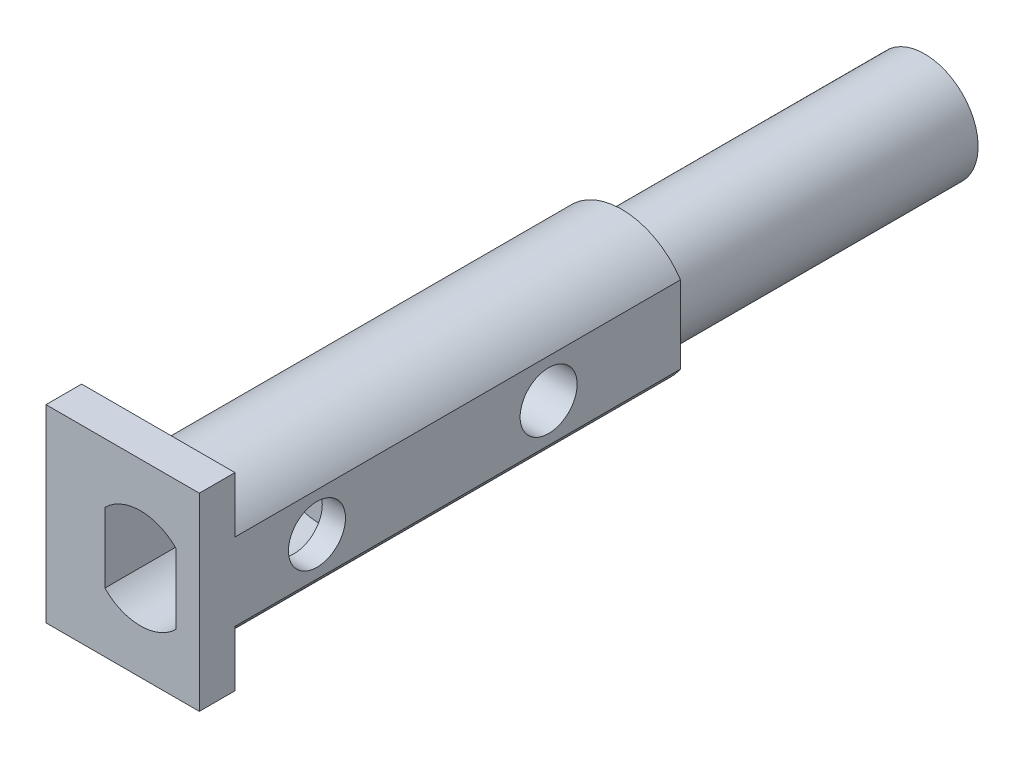
ISO-10303-21;
HEADER;
FILE_DESCRIPTION(('STEP AP214'),'2;1');
FILE_NAME('part.step','',(''),(''),'','','');
FILE_SCHEMA(('AUTOMOTIVE_DESIGN { 1 0 10303 214 1 1 1 1 }'));
ENDSEC;
DATA;
#1=APPLICATION_CONTEXT('core data for automotive mechanical design processes');
#2=APPLICATION_PROTOCOL_DEFINITION('international standard','automotive_design',2000,#1);
#3=PRODUCT_CONTEXT('',#1,'mechanical');
#4=PRODUCT('Part','Part','',(#3));
#5=PRODUCT_RELATED_PRODUCT_CATEGORY('part','',(#4));
#6=PRODUCT_DEFINITION_FORMATION('','',#4);
#7=PRODUCT_DEFINITION_CONTEXT('part definition',#1,'design');
#8=PRODUCT_DEFINITION('design','',#6,#7);
#9=PRODUCT_DEFINITION_SHAPE('','',#8);
#10=(LENGTH_UNIT() NAMED_UNIT(*) SI_UNIT(.MILLI.,.METRE.));
#11=(NAMED_UNIT(*) PLANE_ANGLE_UNIT() SI_UNIT($,.RADIAN.));
#12=(NAMED_UNIT(*) SI_UNIT($,.STERADIAN.) SOLID_ANGLE_UNIT());
#13=UNCERTAINTY_MEASURE_WITH_UNIT(LENGTH_MEASURE(1.E-05),#10,'distance_accuracy_value','');
#14=(GEOMETRIC_REPRESENTATION_CONTEXT(3) GLOBAL_UNCERTAINTY_ASSIGNED_CONTEXT((#13)) GLOBAL_UNIT_ASSIGNED_CONTEXT((#10,
#11,#12)) REPRESENTATION_CONTEXT('',''));
#15=CARTESIAN_POINT('',(0.,0.,0.));
#16=DIRECTION('',(0.,0.,1.));
#17=DIRECTION('',(1.,0.,0.));
#18=AXIS2_PLACEMENT_3D('',#15,#16,#17);
#19=CARTESIAN_POINT('',(-5.3033008588991,-5.30330085889911,2.));
#20=DIRECTION('',(1.,0.,0.));
#21=DIRECTION('',(0.,0.,-1.));
#22=AXIS2_PLACEMENT_3D('',#19,#20,#21);
#23=PLANE('',#22);
#24=DIRECTION('',(0.,-1.,0.));
#25=VECTOR('',#24,1.);
#26=CARTESIAN_POINT('',(-5.3033008588991,-5.30330085889911,0.));
#27=LINE('',#26,#25);
#28=CARTESIAN_POINT('',(-5.3033008588991,5.30330085889911,0.));
#29=VERTEX_POINT('',#28);
#30=CARTESIAN_POINT('',(-5.3033008588991,-5.30330085889911,0.));
#31=VERTEX_POINT('',#30);
#32=EDGE_CURVE('E130',#29,#31,#27,.T.);
#33=ORIENTED_EDGE('',*,*,#32,.T.);
#34=DIRECTION('',(0.,0.,-1.));
#35=VECTOR('',#34,1.);
#36=CARTESIAN_POINT('',(-5.3033008588991,-5.30330085889911,2.));
#37=LINE('',#36,#35);
#38=CARTESIAN_POINT('',(-5.3033008588991,-5.30330085889911,2.));
#39=VERTEX_POINT('',#38);
#40=EDGE_CURVE('E157',#39,#31,#37,.T.);
#41=ORIENTED_EDGE('',*,*,#40,.F.);
#42=DIRECTION('',(0.,-1.,0.));
#43=VECTOR('',#42,1.);
#44=CARTESIAN_POINT('',(-5.3033008588991,-5.30330085889911,2.));
#45=LINE('',#44,#43);
#46=CARTESIAN_POINT('',(-5.3033008588991,5.30330085889911,2.));
#47=VERTEX_POINT('',#46);
#48=EDGE_CURVE('E142',#47,#39,#45,.T.);
#49=ORIENTED_EDGE('',*,*,#48,.F.);
#50=DIRECTION('',(0.,0.,-1.));
#51=VECTOR('',#50,1.);
#52=CARTESIAN_POINT('',(-5.3033008588991,5.30330085889911,2.));
#53=LINE('',#52,#51);
#54=EDGE_CURVE('E150',#47,#29,#53,.T.);
#55=ORIENTED_EDGE('',*,*,#54,.T.);
#56=EDGE_LOOP('',(#33,#41,#49,#55));
#57=FACE_BOUND('',#56,.T.);
#58=ADVANCED_FACE('F35',(#57),#23,.F.);
#59=CARTESIAN_POINT('',(5.30330085889911,-5.3033008588991,2.));
#60=DIRECTION('',(0.,1.,0.));
#61=DIRECTION('',(-1.,0.,0.));
#62=AXIS2_PLACEMENT_3D('',#59,#60,#61);
#63=PLANE('',#62);
#64=DIRECTION('',(1.,0.,0.));
#65=VECTOR('',#64,1.);
#66=CARTESIAN_POINT('',(5.30330085889911,-5.3033008588991,0.));
#67=LINE('',#66,#65);
#68=CARTESIAN_POINT('',(3.3,-5.30330085889911,0.));
#69=VERTEX_POINT('',#68);
#70=EDGE_CURVE('E134',#31,#69,#67,.T.);
#71=ORIENTED_EDGE('',*,*,#70,.T.);
#72=DIRECTION('',(0.,0.,1.));
#73=VECTOR('',#72,1.);
#74=CARTESIAN_POINT('',(3.3,-5.3033008588991,2.));
#75=LINE('',#74,#73);
#76=CARTESIAN_POINT('',(3.3,-5.30330085889911,2.));
#77=VERTEX_POINT('',#76);
#78=EDGE_CURVE('E171',#69,#77,#75,.T.);
#79=ORIENTED_EDGE('',*,*,#78,.T.);
#80=DIRECTION('',(1.,0.,0.));
#81=VECTOR('',#80,1.);
#82=CARTESIAN_POINT('',(5.30330085889911,-5.3033008588991,2.));
#83=LINE('',#82,#81);
#84=EDGE_CURVE('E145',#39,#77,#83,.T.);
#85=ORIENTED_EDGE('',*,*,#84,.F.);
#86=ORIENTED_EDGE('',*,*,#40,.T.);
#87=EDGE_LOOP('',(#71,#79,#85,#86));
#88=FACE_BOUND('',#87,.T.);
#89=ADVANCED_FACE('F249',(#88),#63,.F.);
#90=CARTESIAN_POINT('',(5.30330085889911,5.30330085889911,2.));
#91=DIRECTION('',(0.,-1.,0.));
#92=DIRECTION('',(1.,0.,0.));
#93=AXIS2_PLACEMENT_3D('',#90,#91,#92);
#94=PLANE('',#93);
#95=DIRECTION('',(-1.,0.,0.));
#96=VECTOR('',#95,1.);
#97=CARTESIAN_POINT('',(5.30330085889911,5.30330085889911,2.));
#98=LINE('',#97,#96);
#99=CARTESIAN_POINT('',(3.3,5.30330085889911,2.));
#100=VERTEX_POINT('',#99);
#101=EDGE_CURVE('E149',#100,#47,#98,.T.);
#102=ORIENTED_EDGE('',*,*,#101,.F.);
#103=DIRECTION('',(0.,0.,-1.));
#104=VECTOR('',#103,1.);
#105=CARTESIAN_POINT('',(3.3,5.30330085889911,2.));
#106=LINE('',#105,#104);
#107=CARTESIAN_POINT('',(3.3,5.30330085889911,0.));
#108=VERTEX_POINT('',#107);
#109=EDGE_CURVE('E271',#100,#108,#106,.T.);
#110=ORIENTED_EDGE('',*,*,#109,.T.);
#111=DIRECTION('',(-1.,0.,0.));
#112=VECTOR('',#111,1.);
#113=CARTESIAN_POINT('',(5.30330085889911,5.30330085889911,0.));
#114=LINE('',#113,#112);
#115=EDGE_CURVE('E146',#108,#29,#114,.T.);
#116=ORIENTED_EDGE('',*,*,#115,.T.);
#117=ORIENTED_EDGE('',*,*,#54,.F.);
#118=EDGE_LOOP('',(#102,#110,#116,#117));
#119=FACE_BOUND('',#118,.T.);
#120=ADVANCED_FACE('F254',(#119),#94,.F.);
#121=CARTESIAN_POINT('',(0.,0.,2.));
#122=DIRECTION('',(0.,0.,1.));
#123=DIRECTION('',(1.,0.,0.));
#124=AXIS2_PLACEMENT_3D('',#121,#122,#123);
#125=PLANE('',#124);
#126=DIRECTION('',(0.,1.,0.));
#127=VECTOR('',#126,1.);
#128=CARTESIAN_POINT('',(3.3,6.81051230128347,2.));
#129=LINE('',#128,#127);
#130=EDGE_CURVE('E118',#77,#100,#129,.T.);
#131=ORIENTED_EDGE('',*,*,#130,.T.);
#132=ORIENTED_EDGE('',*,*,#101,.T.);
#133=ORIENTED_EDGE('',*,*,#48,.T.);
#134=ORIENTED_EDGE('',*,*,#84,.T.);
#135=EDGE_LOOP('',(#131,#132,#133,#134));
#136=FACE_BOUND('',#135,.T.);
#137=CARTESIAN_POINT('',(0.,0.,2.));
#138=DIRECTION('',(0.,0.,1.));
#139=DIRECTION('',(1.,0.,0.));
#140=AXIS2_PLACEMENT_3D('',#137,#138,#139);
#141=CIRCLE('',#140,2.8);
#142=CARTESIAN_POINT('',(2.,1.95959179422654,2.));
#143=VERTEX_POINT('',#142);
#144=CARTESIAN_POINT('',(-2.,1.95959179422654,2.));
#145=VERTEX_POINT('',#144);
#146=EDGE_CURVE('E59',#143,#145,#141,.T.);
#147=ORIENTED_EDGE('',*,*,#146,.F.);
#148=DIRECTION('',(0.,1.,0.));
#149=VECTOR('',#148,1.);
#150=CARTESIAN_POINT('',(2.,-1.95959179422654,2.));
#151=LINE('',#150,#149);
#152=CARTESIAN_POINT('',(2.,-1.95959179422654,2.));
#153=VERTEX_POINT('',#152);
#154=EDGE_CURVE('E203',#153,#143,#151,.T.);
#155=ORIENTED_EDGE('',*,*,#154,.F.);
#156=CARTESIAN_POINT('',(0.,0.,2.));
#157=DIRECTION('',(0.,0.,1.));
#158=DIRECTION('',(1.,0.,0.));
#159=AXIS2_PLACEMENT_3D('',#156,#157,#158);
#160=CIRCLE('',#159,2.8);
#161=CARTESIAN_POINT('',(-2.,-1.95959179422654,2.));
#162=VERTEX_POINT('',#161);
#163=EDGE_CURVE('E216',#162,#153,#160,.T.);
#164=ORIENTED_EDGE('',*,*,#163,.F.);
#165=DIRECTION('',(0.,-1.,0.));
#166=VECTOR('',#165,1.);
#167=CARTESIAN_POINT('',(-2.,-1.95959179422654,2.));
#168=LINE('',#167,#166);
#169=EDGE_CURVE('E213',#145,#162,#168,.T.);
#170=ORIENTED_EDGE('',*,*,#169,.F.);
#171=EDGE_LOOP('',(#147,#155,#164,#170));
#172=FACE_BOUND('',#171,.T.);
#173=ADVANCED_FACE('F231',(#136,#172),#125,.T.);
#174=CARTESIAN_POINT('',(0.,0.,0.));
#175=DIRECTION('',(0.,0.,1.));
#176=DIRECTION('',(1.,0.,0.));
#177=AXIS2_PLACEMENT_3D('',#174,#175,#176);
#178=PLANE('',#177);
#179=ORIENTED_EDGE('',*,*,#115,.F.);
#180=DIRECTION('',(0.,-1.,0.));
#181=VECTOR('',#180,1.);
#182=CARTESIAN_POINT('',(3.3,0.,0.));
#183=LINE('',#182,#181);
#184=CARTESIAN_POINT('',(3.3,2.17082933460924,0.));
#185=VERTEX_POINT('',#184);
#186=EDGE_CURVE('E126',#108,#185,#183,.T.);
#187=ORIENTED_EDGE('',*,*,#186,.T.);
#188=CARTESIAN_POINT('',(0.,0.,0.));
#189=DIRECTION('',(0.,0.,1.));
#190=DIRECTION('',(1.,0.,0.));
#191=AXIS2_PLACEMENT_3D('',#188,#189,#190);
#192=CIRCLE('',#191,3.95);
#193=CARTESIAN_POINT('',(3.3,-2.17082933460924,0.));
#194=VERTEX_POINT('',#193);
#195=EDGE_CURVE('E43',#194,#185,#192,.F.);
#196=ORIENTED_EDGE('',*,*,#195,.F.);
#197=EDGE_CURVE('E264',#194,#69,#183,.T.);
#198=ORIENTED_EDGE('',*,*,#197,.T.);
#199=ORIENTED_EDGE('',*,*,#70,.F.);
#200=ORIENTED_EDGE('',*,*,#32,.F.);
#201=EDGE_LOOP('',(#179,#187,#196,#198,#199,#200));
#202=FACE_BOUND('',#201,.T.);
#203=ADVANCED_FACE('F262',(#202),#178,.F.);
#204=CARTESIAN_POINT('',(0.,0.,-25.));
#205=DIRECTION('',(0.,0.,1.));
#206=DIRECTION('',(1.,0.,0.));
#207=AXIS2_PLACEMENT_3D('',#204,#205,#206);
#208=CYLINDRICAL_SURFACE('',#207,3.95);
#209=CARTESIAN_POINT('',(-3.95,0.,-19.2));
#210=CARTESIAN_POINT('',(-3.94999379590642,0.0859077321557282,-19.1999916550053));
#211=CARTESIAN_POINT('',(-3.94716465691992,0.171960508165552,-19.1930398920778));
#212=CARTESIAN_POINT('',(-3.93612262605428,0.341636442293054,-19.1654753191493));
#213=CARTESIAN_POINT('',(-3.92789527110763,0.425252441381752,-19.144825808078));
#214=CARTESIAN_POINT('',(-3.90694267817301,0.58732565213353,-19.0907442720734));
#215=CARTESIAN_POINT('',(-3.89423233289273,0.665798936827778,-19.0573545410689));
#216=CARTESIAN_POINT('',(-3.86556133416429,0.815957533998014,-18.9789102133528));
#217=CARTESIAN_POINT('',(-3.84960176596475,0.887645101239577,-18.9338595100754));
#218=CARTESIAN_POINT('',(-3.81518363905526,1.02574826393297,-18.8310848181557));
#219=CARTESIAN_POINT('',(-3.79664621239121,1.09179510750592,-18.772891931647));
#220=CARTESIAN_POINT('',(-3.75951612001247,1.21350548338532,-18.6464749128529));
#221=CARTESIAN_POINT('',(-3.7409234313628,1.26916382180316,-18.5782457931209));
#222=CARTESIAN_POINT('',(-3.70483728932636,1.37103573094095,-18.4298919890851));
#223=CARTESIAN_POINT('',(-3.68743345926833,1.41669853996951,-18.349365049844));
#224=CARTESIAN_POINT('',(-3.65693685641008,1.49366649852331,-18.1809639893364));
#225=CARTESIAN_POINT('',(-3.64384198477753,1.52497864098217,-18.0930934712556));
#226=CARTESIAN_POINT('',(-3.62429472437666,1.57085557676029,-17.9167394050751));
#227=CARTESIAN_POINT('',(-3.61756330485353,1.58612751431657,-17.8284718912971));
#228=CARTESIAN_POINT('',(-3.61069817456082,1.6016987007412,-17.6503901386177));
#229=CARTESIAN_POINT('',(-3.61056110427824,1.60200557361225,-17.5605767106184));
#230=CARTESIAN_POINT('',(-3.6166626916494,1.58817282611031,-17.3888209567203));
#231=CARTESIAN_POINT('',(-3.62244496832578,1.57506731922361,-17.3067759511717));
#232=CARTESIAN_POINT('',(-3.63896616369862,1.53650919256077,-17.1461687548221));
#233=CARTESIAN_POINT('',(-3.64970597192727,1.51105435689702,-17.0676071918307));
#234=CARTESIAN_POINT('',(-3.67517016363188,1.44803161287774,-16.914274076503));
#235=CARTESIAN_POINT('',(-3.68997237200738,1.41022403947253,-16.8396145330093));
#236=CARTESIAN_POINT('',(-3.72187311796671,1.32373763358919,-16.6974201713575));
#237=CARTESIAN_POINT('',(-3.7389725305385,1.2750546540435,-16.6298880855826));
#238=CARTESIAN_POINT('',(-3.77519514377456,1.16365466611768,-16.4982190793749));
#239=CARTESIAN_POINT('',(-3.79437119679803,1.10012994730087,-16.4347782069349));
#240=CARTESIAN_POINT('',(-3.83143400894788,0.963142929101399,-16.3192240338791));
#241=CARTESIAN_POINT('',(-3.84932049759423,0.889678554164185,-16.2671131050723));
#242=CARTESIAN_POINT('',(-3.88225775533471,0.732881158291157,-16.1747528809109));
#243=CARTESIAN_POINT('',(-3.89724206881569,0.649375159500433,-16.1347718111597));
#244=CARTESIAN_POINT('',(-3.922181990994,0.476061375318487,-16.0696660350169));
#245=CARTESIAN_POINT('',(-3.93214022119439,0.386256902981335,-16.0445335827183));
#246=CARTESIAN_POINT('',(-3.94542459215147,0.208724533739425,-16.0112608744955));
#247=CARTESIAN_POINT('',(-3.94911512677478,0.121199066921181,-16.0021856046835));
#248=CARTESIAN_POINT('',(-3.95060071041494,-0.0541938764247007,-15.9985159867403));
#249=CARTESIAN_POINT('',(-3.94839733598265,-0.142061255216753,-16.0039177661707));
#250=CARTESIAN_POINT('',(-3.93858059347028,-0.31136370806182,-16.028366706555));
#251=CARTESIAN_POINT('',(-3.93122258224669,-0.392908191563037,-16.0467701266381));
#252=CARTESIAN_POINT('',(-3.91210369996182,-0.551672579317282,-16.0958180319386));
#253=CARTESIAN_POINT('',(-3.90034226583763,-0.62889192906591,-16.126464082647));
#254=CARTESIAN_POINT('',(-3.87310408548293,-0.779489223977343,-16.2001286880824));
#255=CARTESIAN_POINT('',(-3.85752418102271,-0.852675933877134,-16.2434988371676));
#256=CARTESIAN_POINT('',(-3.82433041096255,-0.990991615978243,-16.3409916578839));
#257=CARTESIAN_POINT('',(-3.80671572028317,-1.0561172972074,-16.3951186977487));
#258=CARTESIAN_POINT('',(-3.76988841835221,-1.18108814082411,-16.516881259089));
#259=CARTESIAN_POINT('',(-3.75064833634512,-1.24027776609804,-16.5851830301985));
#260=CARTESIAN_POINT('',(-3.71383176873331,-1.34652272225712,-16.7310804612434));
#261=CARTESIAN_POINT('',(-3.69625558731186,-1.39357583712715,-16.8086778146841));
#262=CARTESIAN_POINT('',(-3.66470495525766,-1.47456996129036,-16.9722589192486));
#263=CARTESIAN_POINT('',(-3.65077223389056,-1.50836110249075,-17.0583255038484));
#264=CARTESIAN_POINT('',(-3.62870953262366,-1.56070148841118,-17.2356641018007));
#265=CARTESIAN_POINT('',(-3.62057512140545,-1.57926237439182,-17.3269320822858));
#266=CARTESIAN_POINT('',(-3.61168155811158,-1.59948964035799,-17.5048536785259));
#267=CARTESIAN_POINT('',(-3.61042424247238,-1.60229755591094,-17.5913533604062));
#268=CARTESIAN_POINT('',(-3.61411655329279,-1.59395185398861,-17.7635327606292));
#269=CARTESIAN_POINT('',(-3.61906534523779,-1.58280011362214,-17.8492125876542));
#270=CARTESIAN_POINT('',(-3.63416797193795,-1.54779216749586,-18.0136630301261));
#271=CARTESIAN_POINT('',(-3.64409678783653,-1.52448358396572,-18.0925727976111));
#272=CARTESIAN_POINT('',(-3.66787680868113,-1.46634274381066,-18.2453893632212));
#273=CARTESIAN_POINT('',(-3.68172910265356,-1.43150728725855,-18.3192947652346));
#274=CARTESIAN_POINT('',(-3.71279532694713,-1.34896281261509,-18.4646902255109));
#275=CARTESIAN_POINT('',(-3.73015791598264,-1.30062288942569,-18.5357898002129));
#276=CARTESIAN_POINT('',(-3.76584691631165,-1.19335216104212,-18.6692260227832));
#277=CARTESIAN_POINT('',(-3.78417363020855,-1.13441801651281,-18.7315598965992));
#278=CARTESIAN_POINT('',(-3.82120608968873,-1.00292100616807,-18.8499972793726));
#279=CARTESIAN_POINT('',(-3.83985454069275,-0.929708413753419,-18.9054005829582));
#280=CARTESIAN_POINT('',(-3.87417673576788,-0.774322530110469,-19.0031559583822));
#281=CARTESIAN_POINT('',(-3.88984910570161,-0.692145127024242,-19.0455020069333));
#282=CARTESIAN_POINT('',(-3.91619878681009,-0.522605310186931,-19.1149682227071));
#283=CARTESIAN_POINT('',(-3.92696120811018,-0.435363361478888,-19.1423495919973));
#284=CARTESIAN_POINT('',(-3.94262733791631,-0.257151225703101,-19.18181810637));
#285=CARTESIAN_POINT('',(-3.94754956284656,-0.166193772628573,-19.1939535959662));
#286=CARTESIAN_POINT('',(-3.94976439647011,-0.0500034308579887,-19.1994164730771));
#287=CARTESIAN_POINT('',(-3.95000180602032,-0.0250078609388315,-19.2000024292396));
#288=CARTESIAN_POINT('',(-3.95,0.,-19.2));
#289=B_SPLINE_CURVE_WITH_KNOTS('',3,(#209,#210,#211,#212,#213,#214,#215,#216,#217,#218,#219,
#220,#221,#222,#223,#224,#225,#226,#227,#228,#229,#230,#231,#232,#233,#234,#235,#236,#237,#238,
#239,#240,#241,#242,#243,#244,#245,#246,#247,#248,#249,#250,#251,#252,#253,#254,#255,#256,#257,
#258,#259,#260,#261,#262,#263,#264,#265,#266,#267,#268,#269,#270,#271,#272,#273,#274,#275,#276,
#277,#278,#279,#280,#281,#282,#283,#284,#285,#286,#287,#288),.UNSPECIFIED.,.T.,.F.,(4,2,2,2,2,2,
2,2,2,2,2,2,2,2,2,2,2,2,2,2,2,2,2,2,2,2,2,2,2,2,2,2,2,2,2,2,2,2,2,4),(0.,0.257655045685028,
0.516003243154266,0.773501156162773,1.03091320490201,1.29960683517439,1.5684344450968,
1.84960097097946,2.1306303412235,2.39867107103376,2.66657524516244,2.91527296827918,
3.16401533270003,3.41790287629517,3.67188739939658,3.94605133721536,4.22027261333428,
4.50017732626546,4.77993589531559,5.04278958082348,5.30557296311518,5.5561824162334,
5.8068239255751,6.06517547226243,6.32363214732916,6.59957820054954,6.87557460336945,
7.15460582542832,7.43342357050492,7.69174703190008,7.95003576112403,8.19758313300221,
8.44519928320902,8.70721714442973,8.96931773986301,9.24903212422418,9.52887534793323,
9.80366390035451,10.0775788837508,10.1525826277793),.UNSPECIFIED.);
#290=CARTESIAN_POINT('',(-3.95,0.,-19.2));
#291=VERTEX_POINT('',#290);
#292=EDGE_CURVE('E164',#291,#291,#289,.T.);
#293=ORIENTED_EDGE('',*,*,#292,.T.);
#294=EDGE_LOOP('',(#293));
#295=FACE_BOUND('',#294,.T.);
#296=CARTESIAN_POINT('',(-3.95,0.,-6.2));
#297=CARTESIAN_POINT('',(-3.94999379590642,0.085907732155728,-6.19999165500529));
#298=CARTESIAN_POINT('',(-3.94716465691992,0.171960508165552,-6.19303989207781));
#299=CARTESIAN_POINT('',(-3.93612262605428,0.341636442293054,-6.1654753191493));
#300=CARTESIAN_POINT('',(-3.92789527110763,0.425252441381752,-6.14482580807804));
#301=CARTESIAN_POINT('',(-3.90694267817301,0.587325652133531,-6.09074427207344));
#302=CARTESIAN_POINT('',(-3.89423233289273,0.665798936827778,-6.05735454106887));
#303=CARTESIAN_POINT('',(-3.86556133416429,0.815957533998015,-5.97891021335275));
#304=CARTESIAN_POINT('',(-3.84960176596475,0.887645101239578,-5.93385951007541));
#305=CARTESIAN_POINT('',(-3.81518363905526,1.02574826393297,-5.83108481815573));
#306=CARTESIAN_POINT('',(-3.79664621239121,1.09179510750592,-5.77289193164703));
#307=CARTESIAN_POINT('',(-3.75951612001247,1.21350548338532,-5.64647491285291));
#308=CARTESIAN_POINT('',(-3.7409234313628,1.26916382180316,-5.57824579312093));
#309=CARTESIAN_POINT('',(-3.70483728932636,1.37103573094096,-5.42989198908515));
#310=CARTESIAN_POINT('',(-3.68743345926833,1.41669853996952,-5.34936504984397));
#311=CARTESIAN_POINT('',(-3.65693685641008,1.49366649852331,-5.18096398933645));
#312=CARTESIAN_POINT('',(-3.64384198477753,1.52497864098217,-5.09309347125565));
#313=CARTESIAN_POINT('',(-3.62429472437666,1.57085557676029,-4.91673940507506));
#314=CARTESIAN_POINT('',(-3.61756330485353,1.58612751431658,-4.82847189129711));
#315=CARTESIAN_POINT('',(-3.61069817456082,1.60169870074121,-4.65039013861765));
#316=CARTESIAN_POINT('',(-3.61056110427824,1.60200557361225,-4.56057671061839));
#317=CARTESIAN_POINT('',(-3.6166626916494,1.58817282611031,-4.38882095672033));
#318=CARTESIAN_POINT('',(-3.62244496832578,1.57506731922361,-4.30677595117174));
#319=CARTESIAN_POINT('',(-3.63896616369862,1.53650919256078,-4.1461687548221));
#320=CARTESIAN_POINT('',(-3.64970597192726,1.51105435689702,-4.06760719183069));
#321=CARTESIAN_POINT('',(-3.67517016363188,1.44803161287774,-3.91427407650297));
#322=CARTESIAN_POINT('',(-3.68997237200737,1.41022403947254,-3.83961453300925));
#323=CARTESIAN_POINT('',(-3.72187311796671,1.32373763358919,-3.69742017135751));
#324=CARTESIAN_POINT('',(-3.7389725305385,1.27505465404351,-3.62988808558261));
#325=CARTESIAN_POINT('',(-3.77519514377456,1.16365466611768,-3.49821907937492));
#326=CARTESIAN_POINT('',(-3.79437119679803,1.10012994730087,-3.43477820693486));
#327=CARTESIAN_POINT('',(-3.83143400894788,0.963142929101401,-3.31922403387909));
#328=CARTESIAN_POINT('',(-3.84932049759423,0.889678554164187,-3.26711310507229));
#329=CARTESIAN_POINT('',(-3.88225775533471,0.732881158291159,-3.17475288091095));
#330=CARTESIAN_POINT('',(-3.89724206881569,0.649375159500434,-3.13477181115971));
#331=CARTESIAN_POINT('',(-3.922181990994,0.476061375318489,-3.06966603501687));
#332=CARTESIAN_POINT('',(-3.93214022119439,0.386256902981337,-3.04453358271834));
#333=CARTESIAN_POINT('',(-3.94542459215147,0.208724533739427,-3.01126087449547));
#334=CARTESIAN_POINT('',(-3.94911512677478,0.121199066921183,-3.00218560468348));
#335=CARTESIAN_POINT('',(-3.95060071041494,-0.054193876424699,-2.9985159867403));
#336=CARTESIAN_POINT('',(-3.94839733598265,-0.142061255216752,-3.00391776617065));
#337=CARTESIAN_POINT('',(-3.93858059347028,-0.311363708061819,-3.02836670655499));
#338=CARTESIAN_POINT('',(-3.93122258224669,-0.392908191563035,-3.04677012663813));
#339=CARTESIAN_POINT('',(-3.91210369996182,-0.551672579317281,-3.0958180319386));
#340=CARTESIAN_POINT('',(-3.90034226583763,-0.62889192906591,-3.12646408264698));
#341=CARTESIAN_POINT('',(-3.87310408548293,-0.779489223977345,-3.20012868808235));
#342=CARTESIAN_POINT('',(-3.85752418102271,-0.852675933877135,-3.24349883716763));
#343=CARTESIAN_POINT('',(-3.82433041096255,-0.990991615978244,-3.3409916578839));
#344=CARTESIAN_POINT('',(-3.80671572028317,-1.0561172972074,-3.39511869774865));
#345=CARTESIAN_POINT('',(-3.76988841835221,-1.18108814082411,-3.51688125908896));
#346=CARTESIAN_POINT('',(-3.75064833634512,-1.24027776609804,-3.58518303019848));
#347=CARTESIAN_POINT('',(-3.71383176873331,-1.34652272225713,-3.73108046124341));
#348=CARTESIAN_POINT('',(-3.69625558731186,-1.39357583712716,-3.8086778146841));
#349=CARTESIAN_POINT('',(-3.66470495525766,-1.47456996129036,-3.97225891924859));
#350=CARTESIAN_POINT('',(-3.65077223389055,-1.50836110249075,-4.05832550384835));
#351=CARTESIAN_POINT('',(-3.62870953262366,-1.56070148841118,-4.23566410180071));
#352=CARTESIAN_POINT('',(-3.62057512140545,-1.57926237439182,-4.32693208228583));
#353=CARTESIAN_POINT('',(-3.61168155811158,-1.599489640358,-4.50485367852593));
#354=CARTESIAN_POINT('',(-3.61042424247238,-1.60229755591095,-4.59135336040618));
#355=CARTESIAN_POINT('',(-3.61411655329279,-1.59395185398862,-4.76353276062917));
#356=CARTESIAN_POINT('',(-3.61906534523779,-1.58280011362214,-4.84921258765417));
#357=CARTESIAN_POINT('',(-3.63416797193795,-1.54779216749586,-5.01366303012615));
#358=CARTESIAN_POINT('',(-3.64409678783653,-1.52448358396572,-5.09257279761112));
#359=CARTESIAN_POINT('',(-3.66787680868112,-1.46634274381066,-5.24538936322122));
#360=CARTESIAN_POINT('',(-3.68172910265356,-1.43150728725855,-5.31929476523465));
#361=CARTESIAN_POINT('',(-3.71279532694713,-1.3489628126151,-5.46469022551091));
#362=CARTESIAN_POINT('',(-3.73015791598264,-1.3006228894257,-5.53578980021291));
#363=CARTESIAN_POINT('',(-3.76584691631165,-1.19335216104212,-5.6692260227832));
#364=CARTESIAN_POINT('',(-3.78417363020855,-1.13441801651281,-5.73155989659916));
#365=CARTESIAN_POINT('',(-3.82120608968873,-1.00292100616808,-5.84999727937256));
#366=CARTESIAN_POINT('',(-3.83985454069275,-0.929708413753423,-5.90540058295817));
#367=CARTESIAN_POINT('',(-3.87417673576788,-0.774322530110472,-6.00315595838216));
#368=CARTESIAN_POINT('',(-3.88984910570161,-0.692145127024245,-6.0455020069333));
#369=CARTESIAN_POINT('',(-3.91619878681009,-0.522605310186935,-6.11496822270714));
#370=CARTESIAN_POINT('',(-3.92696120811018,-0.435363361478892,-6.14234959199733));
#371=CARTESIAN_POINT('',(-3.94262733791631,-0.257151225703105,-6.18181810636996));
#372=CARTESIAN_POINT('',(-3.94754956284656,-0.166193772628575,-6.19395359596624));
#373=CARTESIAN_POINT('',(-3.94976439647011,-0.0500034308579894,-6.19941647307713));
#374=CARTESIAN_POINT('',(-3.95000180602032,-0.0250078609388319,-6.20000242923963));
#375=CARTESIAN_POINT('',(-3.95,0.,-6.2));
#376=B_SPLINE_CURVE_WITH_KNOTS('',3,(#296,#297,#298,#299,#300,#301,#302,#303,#304,#305,#306,
#307,#308,#309,#310,#311,#312,#313,#314,#315,#316,#317,#318,#319,#320,#321,#322,#323,#324,#325,
#326,#327,#328,#329,#330,#331,#332,#333,#334,#335,#336,#337,#338,#339,#340,#341,#342,#343,#344,
#345,#346,#347,#348,#349,#350,#351,#352,#353,#354,#355,#356,#357,#358,#359,#360,#361,#362,#363,
#364,#365,#366,#367,#368,#369,#370,#371,#372,#373,#374,#375),.UNSPECIFIED.,.T.,.F.,(4,2,2,2,2,2,
2,2,2,2,2,2,2,2,2,2,2,2,2,2,2,2,2,2,2,2,2,2,2,2,2,2,2,2,2,2,2,2,2,4),(0.,0.257655045685027,
0.516003243154267,0.773501156162772,1.03091320490202,1.29960683517439,1.5684344450968,
1.84960097097947,2.1306303412235,2.39867107103377,2.66657524516245,2.91527296827919,
3.16401533270004,3.41790287629518,3.67188739939659,3.94605133721537,4.22027261333429,
4.50017732626547,4.7799358953156,5.04278958082349,5.30557296311519,5.55618241623341,
5.80682392557512,6.06517547226244,6.32363214732917,6.59957820054956,6.87557460336947,
7.15460582542833,7.43342357050493,7.6917470319001,7.95003576112405,8.19758313300223,
8.44519928320904,8.70721714442974,8.96931773986303,9.2490321242242,9.52887534793325,
9.80366390035453,10.0775788837508,10.1525826277793),.UNSPECIFIED.);
#377=CARTESIAN_POINT('',(-3.95,0.,-6.2));
#378=VERTEX_POINT('',#377);
#379=EDGE_CURVE('E191',#378,#378,#376,.T.);
#380=ORIENTED_EDGE('',*,*,#379,.T.);
#381=EDGE_LOOP('',(#380));
#382=FACE_BOUND('',#381,.T.);
#383=CARTESIAN_POINT('',(0.,0.,-25.));
#384=DIRECTION('',(0.,0.,-1.));
#385=DIRECTION('',(-1.,0.,0.));
#386=AXIS2_PLACEMENT_3D('',#383,#384,#385);
#387=CIRCLE('',#386,3.95);
#388=CARTESIAN_POINT('',(3.3,-2.17082933460924,-25.));
#389=VERTEX_POINT('',#388);
#390=CARTESIAN_POINT('',(3.3,2.17082933460924,-25.));
#391=VERTEX_POINT('',#390);
#392=EDGE_CURVE('E124',#389,#391,#387,.T.);
#393=ORIENTED_EDGE('',*,*,#392,.F.);
#394=DIRECTION('',(0.,0.,1.));
#395=VECTOR('',#394,1.);
#396=CARTESIAN_POINT('',(3.3,-2.17082933460924,-25.));
#397=LINE('',#396,#395);
#398=EDGE_CURVE('E51',#389,#194,#397,.T.);
#399=ORIENTED_EDGE('',*,*,#398,.T.);
#400=ORIENTED_EDGE('',*,*,#195,.T.);
#401=DIRECTION('',(0.,0.,1.));
#402=VECTOR('',#401,1.);
#403=CARTESIAN_POINT('',(3.3,2.17082933460924,-25.));
#404=LINE('',#403,#402);
#405=EDGE_CURVE('E113',#185,#391,#404,.F.);
#406=ORIENTED_EDGE('',*,*,#405,.T.);
#407=EDGE_LOOP('',(#393,#399,#400,#406));
#408=FACE_BOUND('',#407,.T.);
#409=ADVANCED_FACE('F123',(#295,#382,#408),#208,.T.);
#410=CARTESIAN_POINT('',(0.,0.,-25.));
#411=DIRECTION('',(0.,0.,-1.));
#412=DIRECTION('',(-1.,0.,0.));
#413=AXIS2_PLACEMENT_3D('',#410,#411,#412);
#414=PLANE('',#413);
#415=CARTESIAN_POINT('',(0.,0.,-25.));
#416=DIRECTION('',(0.,0.,-1.));
#417=DIRECTION('',(-1.,0.,0.));
#418=AXIS2_PLACEMENT_3D('',#415,#416,#417);
#419=CIRCLE('',#418,3.);
#420=CARTESIAN_POINT('',(-3.,0.,-25.));
#421=VERTEX_POINT('',#420);
#422=EDGE_CURVE('E11',#421,#421,#419,.T.);
#423=ORIENTED_EDGE('',*,*,#422,.F.);
#424=EDGE_LOOP('',(#423));
#425=FACE_BOUND('',#424,.T.);
#426=DIRECTION('',(0.,1.,0.));
#427=VECTOR('',#426,1.);
#428=CARTESIAN_POINT('',(3.3,6.81051230128347,-25.));
#429=LINE('',#428,#427);
#430=EDGE_CURVE('E110',#389,#391,#429,.T.);
#431=ORIENTED_EDGE('',*,*,#430,.F.);
#432=ORIENTED_EDGE('',*,*,#392,.T.);
#433=EDGE_LOOP('',(#431,#432));
#434=FACE_BOUND('',#433,.T.);
#435=ADVANCED_FACE('F129',(#425,#434),#414,.T.);
#436=CARTESIAN_POINT('',(0.,0.,-8.));
#437=DIRECTION('',(0.,0.,1.));
#438=DIRECTION('',(1.,0.,0.));
#439=AXIS2_PLACEMENT_3D('',#436,#437,#438);
#440=CYLINDRICAL_SURFACE('',#439,2.8);
#441=ORIENTED_EDGE('',*,*,#146,.T.);
#442=DIRECTION('',(0.,0.,1.));
#443=VECTOR('',#442,1.);
#444=CARTESIAN_POINT('',(-2.,1.95959179422654,-8.));
#445=LINE('',#444,#443);
#446=CARTESIAN_POINT('',(-2.,1.95959179422654,-8.));
#447=VERTEX_POINT('',#446);
#448=EDGE_CURVE('E140',#447,#145,#445,.T.);
#449=ORIENTED_EDGE('',*,*,#448,.F.);
#450=CARTESIAN_POINT('',(0.,0.,-8.));
#451=DIRECTION('',(0.,0.,1.));
#452=DIRECTION('',(1.,0.,0.));
#453=AXIS2_PLACEMENT_3D('',#450,#451,#452);
#454=CIRCLE('',#453,2.8);
#455=CARTESIAN_POINT('',(2.,1.95959179422654,-8.));
#456=VERTEX_POINT('',#455);
#457=EDGE_CURVE('E199',#456,#447,#454,.T.);
#458=ORIENTED_EDGE('',*,*,#457,.F.);
#459=DIRECTION('',(0.,0.,1.));
#460=VECTOR('',#459,1.);
#461=CARTESIAN_POINT('',(2.,1.95959179422654,-8.));
#462=LINE('',#461,#460);
#463=EDGE_CURVE('E131',#456,#143,#462,.T.);
#464=ORIENTED_EDGE('',*,*,#463,.T.);
#465=EDGE_LOOP('',(#441,#449,#458,#464));
#466=FACE_BOUND('',#465,.T.);
#467=ADVANCED_FACE('F238',(#466),#440,.F.);
#468=CARTESIAN_POINT('',(2.,-1.95959179422654,-8.));
#469=DIRECTION('',(1.,0.,0.));
#470=DIRECTION('',(0.,0.,-1.));
#471=AXIS2_PLACEMENT_3D('',#468,#469,#470);
#472=PLANE('',#471);
#473=CARTESIAN_POINT('',(2.,0.,-4.6));
#474=DIRECTION('',(1.,0.,0.));
#475=DIRECTION('',(0.,0.,-1.));
#476=AXIS2_PLACEMENT_3D('',#473,#474,#475);
#477=CIRCLE('',#476,1.6);
#478=CARTESIAN_POINT('',(1.99999999999999,0.,-6.2));
#479=VERTEX_POINT('',#478);
#480=EDGE_CURVE('E163',#479,#479,#477,.T.);
#481=ORIENTED_EDGE('',*,*,#480,.T.);
#482=EDGE_LOOP('',(#481));
#483=FACE_BOUND('',#482,.T.);
#484=ORIENTED_EDGE('',*,*,#154,.T.);
#485=ORIENTED_EDGE('',*,*,#463,.F.);
#486=DIRECTION('',(0.,1.,0.));
#487=VECTOR('',#486,1.);
#488=CARTESIAN_POINT('',(2.,-1.95959179422654,-8.));
#489=LINE('',#488,#487);
#490=CARTESIAN_POINT('',(2.,-1.95959179422654,-8.));
#491=VERTEX_POINT('',#490);
#492=EDGE_CURVE('E209',#491,#456,#489,.T.);
#493=ORIENTED_EDGE('',*,*,#492,.F.);
#494=DIRECTION('',(0.,0.,1.));
#495=VECTOR('',#494,1.);
#496=CARTESIAN_POINT('',(2.,-1.95959179422654,-8.));
#497=LINE('',#496,#495);
#498=EDGE_CURVE('E136',#491,#153,#497,.T.);
#499=ORIENTED_EDGE('',*,*,#498,.T.);
#500=EDGE_LOOP('',(#484,#485,#493,#499));
#501=FACE_BOUND('',#500,.T.);
#502=ADVANCED_FACE('F237',(#483,#501),#472,.F.);
#503=CARTESIAN_POINT('',(0.,0.,-8.));
#504=DIRECTION('',(0.,0.,1.));
#505=DIRECTION('',(1.,0.,0.));
#506=AXIS2_PLACEMENT_3D('',#503,#504,#505);
#507=CYLINDRICAL_SURFACE('',#506,2.8);
#508=ORIENTED_EDGE('',*,*,#163,.T.);
#509=ORIENTED_EDGE('',*,*,#498,.F.);
#510=CARTESIAN_POINT('',(0.,0.,-8.));
#511=DIRECTION('',(0.,0.,1.));
#512=DIRECTION('',(1.,0.,0.));
#513=AXIS2_PLACEMENT_3D('',#510,#511,#512);
#514=CIRCLE('',#513,2.8);
#515=CARTESIAN_POINT('',(-2.,-1.95959179422654,-8.));
#516=VERTEX_POINT('',#515);
#517=EDGE_CURVE('E206',#516,#491,#514,.T.);
#518=ORIENTED_EDGE('',*,*,#517,.F.);
#519=DIRECTION('',(0.,0.,1.));
#520=VECTOR('',#519,1.);
#521=CARTESIAN_POINT('',(-2.,-1.95959179422654,-8.));
#522=LINE('',#521,#520);
#523=EDGE_CURVE('E221',#516,#162,#522,.T.);
#524=ORIENTED_EDGE('',*,*,#523,.T.);
#525=EDGE_LOOP('',(#508,#509,#518,#524));
#526=FACE_BOUND('',#525,.T.);
#527=ADVANCED_FACE('F233',(#526),#507,.F.);
#528=CARTESIAN_POINT('',(-2.,-1.95959179422654,-8.));
#529=DIRECTION('',(-1.,0.,0.));
#530=DIRECTION('',(0.,0.,1.));
#531=AXIS2_PLACEMENT_3D('',#528,#529,#530);
#532=PLANE('',#531);
#533=CARTESIAN_POINT('',(-2.,0.,-4.6));
#534=DIRECTION('',(-1.,0.,0.));
#535=DIRECTION('',(0.,0.,1.));
#536=AXIS2_PLACEMENT_3D('',#533,#534,#535);
#537=CIRCLE('',#536,1.6);
#538=CARTESIAN_POINT('',(-2.,0.,-3.));
#539=VERTEX_POINT('',#538);
#540=EDGE_CURVE('E161',#539,#539,#537,.T.);
#541=ORIENTED_EDGE('',*,*,#540,.T.);
#542=EDGE_LOOP('',(#541));
#543=FACE_BOUND('',#542,.T.);
#544=ORIENTED_EDGE('',*,*,#169,.T.);
#545=ORIENTED_EDGE('',*,*,#523,.F.);
#546=DIRECTION('',(0.,-1.,0.));
#547=VECTOR('',#546,1.);
#548=CARTESIAN_POINT('',(-2.,-1.95959179422654,-8.));
#549=LINE('',#548,#547);
#550=EDGE_CURVE('E202',#447,#516,#549,.T.);
#551=ORIENTED_EDGE('',*,*,#550,.F.);
#552=ORIENTED_EDGE('',*,*,#448,.T.);
#553=EDGE_LOOP('',(#544,#545,#551,#552));
#554=FACE_BOUND('',#553,.T.);
#555=ADVANCED_FACE('F227',(#543,#554),#532,.F.);
#556=CARTESIAN_POINT('',(0.,0.,-8.));
#557=DIRECTION('',(0.,0.,1.));
#558=DIRECTION('',(1.,0.,0.));
#559=AXIS2_PLACEMENT_3D('',#556,#557,#558);
#560=PLANE('',#559);
#561=ORIENTED_EDGE('',*,*,#457,.T.);
#562=ORIENTED_EDGE('',*,*,#550,.T.);
#563=ORIENTED_EDGE('',*,*,#517,.T.);
#564=ORIENTED_EDGE('',*,*,#492,.T.);
#565=EDGE_LOOP('',(#561,#562,#563,#564));
#566=FACE_BOUND('',#565,.T.);
#567=ADVANCED_FACE('F188',(#566),#560,.T.);
#568=CARTESIAN_POINT('',(-26.,0.,-4.6));
#569=DIRECTION('',(1.,0.,0.));
#570=DIRECTION('',(0.,0.,-1.));
#571=AXIS2_PLACEMENT_3D('',#568,#569,#570);
#572=CYLINDRICAL_SURFACE('',#571,1.6);
#573=ORIENTED_EDGE('',*,*,#540,.F.);
#574=EDGE_LOOP('',(#573));
#575=FACE_BOUND('',#574,.T.);
#576=ORIENTED_EDGE('',*,*,#379,.F.);
#577=EDGE_LOOP('',(#576));
#578=FACE_BOUND('',#577,.T.);
#579=ADVANCED_FACE('F186',(#575,#578),#572,.F.);
#580=CARTESIAN_POINT('',(3.3,0.,-4.6));
#581=DIRECTION('',(-1.,0.,0.));
#582=DIRECTION('',(0.,0.,1.));
#583=AXIS2_PLACEMENT_3D('',#580,#581,#582);
#584=CIRCLE('',#583,1.6);
#585=CARTESIAN_POINT('',(3.3,0.,-6.2));
#586=VERTEX_POINT('',#585);
#587=EDGE_CURVE('E127',#586,#586,#584,.F.);
#588=CARTESIAN_POINT('',(3.3,0.,-6.2));
#589=CARTESIAN_POINT('',(3.28645833333334,0.,-6.2));
#590=CARTESIAN_POINT('',(3.27291666666667,0.,-6.2));
#591=CARTESIAN_POINT('',(3.24583333333334,0.,-6.2));
#592=CARTESIAN_POINT('',(3.23229166666667,0.,-6.2));
#593=CARTESIAN_POINT('',(3.20520833333334,0.,-6.2));
#594=CARTESIAN_POINT('',(3.19166666666667,0.,-6.2));
#595=CARTESIAN_POINT('',(3.16458333333334,0.,-6.2));
#596=CARTESIAN_POINT('',(3.15104166666667,0.,-6.2));
#597=CARTESIAN_POINT('',(3.12395833333333,0.,-6.2));
#598=CARTESIAN_POINT('',(3.11041666666667,0.,-6.2));
#599=CARTESIAN_POINT('',(3.08333333333334,0.,-6.2));
#600=CARTESIAN_POINT('',(3.06979166666667,0.,-6.2));
#601=CARTESIAN_POINT('',(3.04270833333334,0.,-6.2));
#602=CARTESIAN_POINT('',(3.02916666666667,0.,-6.2));
#603=CARTESIAN_POINT('',(3.00208333333333,0.,-6.2));
#604=CARTESIAN_POINT('',(2.98854166666667,0.,-6.2));
#605=CARTESIAN_POINT('',(2.96145833333334,0.,-6.2));
#606=CARTESIAN_POINT('',(2.94791666666667,0.,-6.2));
#607=CARTESIAN_POINT('',(2.92083333333334,0.,-6.2));
#608=CARTESIAN_POINT('',(2.90729166666667,0.,-6.2));
#609=CARTESIAN_POINT('',(2.88020833333333,0.,-6.2));
#610=CARTESIAN_POINT('',(2.86666666666667,0.,-6.2));
#611=CARTESIAN_POINT('',(2.83958333333333,0.,-6.2));
#612=CARTESIAN_POINT('',(2.82604166666667,0.,-6.2));
#613=CARTESIAN_POINT('',(2.79895833333333,0.,-6.2));
#614=CARTESIAN_POINT('',(2.78541666666667,0.,-6.2));
#615=CARTESIAN_POINT('',(2.75833333333333,0.,-6.2));
#616=CARTESIAN_POINT('',(2.74479166666667,0.,-6.2));
#617=CARTESIAN_POINT('',(2.71770833333333,0.,-6.2));
#618=CARTESIAN_POINT('',(2.70416666666667,0.,-6.2));
#619=CARTESIAN_POINT('',(2.67708333333333,0.,-6.2));
#620=CARTESIAN_POINT('',(2.66354166666667,0.,-6.2));
#621=CARTESIAN_POINT('',(2.63645833333333,0.,-6.2));
#622=CARTESIAN_POINT('',(2.62291666666667,0.,-6.2));
#623=CARTESIAN_POINT('',(2.59583333333333,0.,-6.2));
#624=CARTESIAN_POINT('',(2.58229166666667,0.,-6.2));
#625=CARTESIAN_POINT('',(2.55520833333333,0.,-6.2));
#626=CARTESIAN_POINT('',(2.54166666666667,0.,-6.2));
#627=CARTESIAN_POINT('',(2.51458333333333,0.,-6.2));
#628=CARTESIAN_POINT('',(2.50104166666666,0.,-6.2));
#629=CARTESIAN_POINT('',(2.47395833333333,0.,-6.2));
#630=CARTESIAN_POINT('',(2.46041666666666,0.,-6.2));
#631=CARTESIAN_POINT('',(2.43333333333333,0.,-6.2));
#632=CARTESIAN_POINT('',(2.41979166666667,0.,-6.2));
#633=CARTESIAN_POINT('',(2.39270833333333,0.,-6.2));
#634=CARTESIAN_POINT('',(2.37916666666666,0.,-6.2));
#635=CARTESIAN_POINT('',(2.35208333333333,0.,-6.2));
#636=CARTESIAN_POINT('',(2.33854166666666,0.,-6.2));
#637=CARTESIAN_POINT('',(2.31145833333333,0.,-6.2));
#638=CARTESIAN_POINT('',(2.29791666666666,0.,-6.2));
#639=CARTESIAN_POINT('',(2.27083333333333,0.,-6.2));
#640=CARTESIAN_POINT('',(2.25729166666666,0.,-6.2));
#641=CARTESIAN_POINT('',(2.23020833333333,0.,-6.2));
#642=CARTESIAN_POINT('',(2.21666666666666,0.,-6.2));
#643=CARTESIAN_POINT('',(2.18958333333333,0.,-6.2));
#644=CARTESIAN_POINT('',(2.17604166666666,0.,-6.2));
#645=CARTESIAN_POINT('',(2.14895833333333,0.,-6.2));
#646=CARTESIAN_POINT('',(2.13541666666666,0.,-6.2));
#647=CARTESIAN_POINT('',(2.10833333333333,0.,-6.2));
#648=CARTESIAN_POINT('',(2.09479166666666,0.,-6.2));
#649=CARTESIAN_POINT('',(2.06770833333333,0.,-6.2));
#650=CARTESIAN_POINT('',(2.05416666666666,0.,-6.2));
#651=CARTESIAN_POINT('',(2.02708333333333,0.,-6.2));
#652=CARTESIAN_POINT('',(2.01354166666666,0.,-6.2));
#653=CARTESIAN_POINT('',(1.99999999999999,0.,-6.2));
#654=B_SPLINE_CURVE_WITH_KNOTS('',3,(#588,#589,#590,#591,#592,#593,#594,#595,#596,#597,#598,
#599,#600,#601,#602,#603,#604,#605,#606,#607,#608,#609,#610,#611,#612,#613,#614,#615,#616,#617,
#618,#619,#620,#621,#622,#623,#624,#625,#626,#627,#628,#629,#630,#631,#632,#633,#634,#635,#636,
#637,#638,#639,#640,#641,#642,#643,#644,#645,#646,#647,#648,#649,#650,#651,#652,#653),
.UNSPECIFIED.,.F.,.F.,(4,2,2,2,2,2,2,2,2,2,2,2,2,2,2,2,2,2,2,2,2,2,2,2,2,2,2,2,2,2,2,2,4),(0.,
0.040624999999999,0.0812500000000015,0.121875,0.162500000000003,0.203125000000002,
0.243750000000001,0.284375000000003,0.325000000000002,0.365625000000001,0.406250000000004,
0.446875000000003,0.487500000000002,0.528125000000004,0.568750000000003,0.609375000000006,
0.650000000000005,0.690625000000004,0.731250000000006,0.771875000000005,0.812500000000008,
0.853125000000007,0.893750000000006,0.934375000000008,0.975000000000007,1.01562500000001,
1.05625000000001,1.09687500000001,1.13750000000001,1.17812500000001,1.21875000000001,
1.25937500000001,1.30000000000001),.UNSPECIFIED.);
#655=EDGE_CURVE('BSEAM180',#586,#479,#654,.T.);
#656=ORIENTED_EDGE('',*,*,#587,.T.);
#657=ORIENTED_EDGE('',*,*,#480,.F.);
#658=ORIENTED_EDGE('',*,*,#655,.T.);
#659=ORIENTED_EDGE('',*,*,#655,.F.);
#660=EDGE_LOOP('',(#656,#658,#657,#659));
#661=FACE_BOUND('',#660,.T.);
#662=ADVANCED_FACE('F180',(#661),#572,.F.);
#663=CARTESIAN_POINT('',(-26.,0.,-17.6));
#664=DIRECTION('',(1.,0.,0.));
#665=DIRECTION('',(0.,0.,-1.));
#666=AXIS2_PLACEMENT_3D('',#663,#664,#665);
#667=CYLINDRICAL_SURFACE('',#666,1.6);
#668=CARTESIAN_POINT('',(3.3,0.,-17.6));
#669=DIRECTION('',(-1.,0.,0.));
#670=DIRECTION('',(0.,0.,1.));
#671=AXIS2_PLACEMENT_3D('',#668,#669,#670);
#672=CIRCLE('',#671,1.6);
#673=CARTESIAN_POINT('',(3.3,0.,-16.));
#674=VERTEX_POINT('',#673);
#675=EDGE_CURVE('E38',#674,#674,#672,.F.);
#676=ORIENTED_EDGE('',*,*,#675,.T.);
#677=EDGE_LOOP('',(#676));
#678=FACE_BOUND('',#677,.T.);
#679=ORIENTED_EDGE('',*,*,#292,.F.);
#680=EDGE_LOOP('',(#679));
#681=FACE_BOUND('',#680,.T.);
#682=ADVANCED_FACE('F175',(#678,#681),#667,.F.);
#683=CARTESIAN_POINT('',(3.3,6.81051230128347,2.));
#684=DIRECTION('',(-1.,0.,0.));
#685=DIRECTION('',(0.,0.,1.));
#686=AXIS2_PLACEMENT_3D('',#683,#684,#685);
#687=PLANE('',#686);
#688=ORIENTED_EDGE('',*,*,#675,.F.);
#689=EDGE_LOOP('',(#688));
#690=FACE_BOUND('',#689,.T.);
#691=ORIENTED_EDGE('',*,*,#587,.F.);
#692=EDGE_LOOP('',(#691));
#693=FACE_BOUND('',#692,.T.);
#694=ORIENTED_EDGE('',*,*,#197,.F.);
#695=ORIENTED_EDGE('',*,*,#398,.F.);
#696=ORIENTED_EDGE('',*,*,#430,.T.);
#697=ORIENTED_EDGE('',*,*,#405,.F.);
#698=ORIENTED_EDGE('',*,*,#186,.F.);
#699=ORIENTED_EDGE('',*,*,#109,.F.);
#700=ORIENTED_EDGE('',*,*,#130,.F.);
#701=ORIENTED_EDGE('',*,*,#78,.F.);
#702=EDGE_LOOP('',(#694,#695,#696,#697,#698,#699,#700,#701));
#703=FACE_BOUND('',#702,.T.);
#704=ADVANCED_FACE('F112',(#690,#693,#703),#687,.F.);
#705=CARTESIAN_POINT('',(0.,0.,-42.));
#706=DIRECTION('',(0.,0.,1.));
#707=DIRECTION('',(1.,0.,0.));
#708=AXIS2_PLACEMENT_3D('',#705,#706,#707);
#709=CYLINDRICAL_SURFACE('',#708,3.);
#710=CARTESIAN_POINT('',(0.,0.,-42.));
#711=DIRECTION('',(0.,0.,-1.));
#712=DIRECTION('',(-1.,0.,0.));
#713=AXIS2_PLACEMENT_3D('',#710,#711,#712);
#714=CIRCLE('',#713,3.);
#715=CARTESIAN_POINT('',(-3.,0.,-42.));
#716=VERTEX_POINT('',#715);
#717=EDGE_CURVE('E119',#716,#716,#714,.T.);
#718=ORIENTED_EDGE('',*,*,#717,.F.);
#719=EDGE_LOOP('',(#718));
#720=FACE_BOUND('',#719,.T.);
#721=ORIENTED_EDGE('',*,*,#422,.T.);
#722=EDGE_LOOP('',(#721));
#723=FACE_BOUND('',#722,.T.);
#724=ADVANCED_FACE('F284',(#720,#723),#709,.T.);
#725=CARTESIAN_POINT('',(0.,0.,-42.));
#726=DIRECTION('',(0.,0.,-1.));
#727=DIRECTION('',(-1.,0.,0.));
#728=AXIS2_PLACEMENT_3D('',#725,#726,#727);
#729=PLANE('',#728);
#730=ORIENTED_EDGE('',*,*,#717,.T.);
#731=EDGE_LOOP('',(#730));
#732=FACE_BOUND('',#731,.T.);
#733=ADVANCED_FACE('F282',(#732),#729,.T.);
#734=CLOSED_SHELL('',(#58,#89,#120,#173,#203,#409,#435,#467,#502,#527,#555,#567,#579,#662,#682,
#704,#724,#733));
#735=MANIFOLD_SOLID_BREP('B2',#734);
#736=ADVANCED_BREP_SHAPE_REPRESENTATION('',(#18,#735),#14);
#737=SHAPE_DEFINITION_REPRESENTATION(#9,#736);
ENDSEC;
END-ISO-10303-21;
